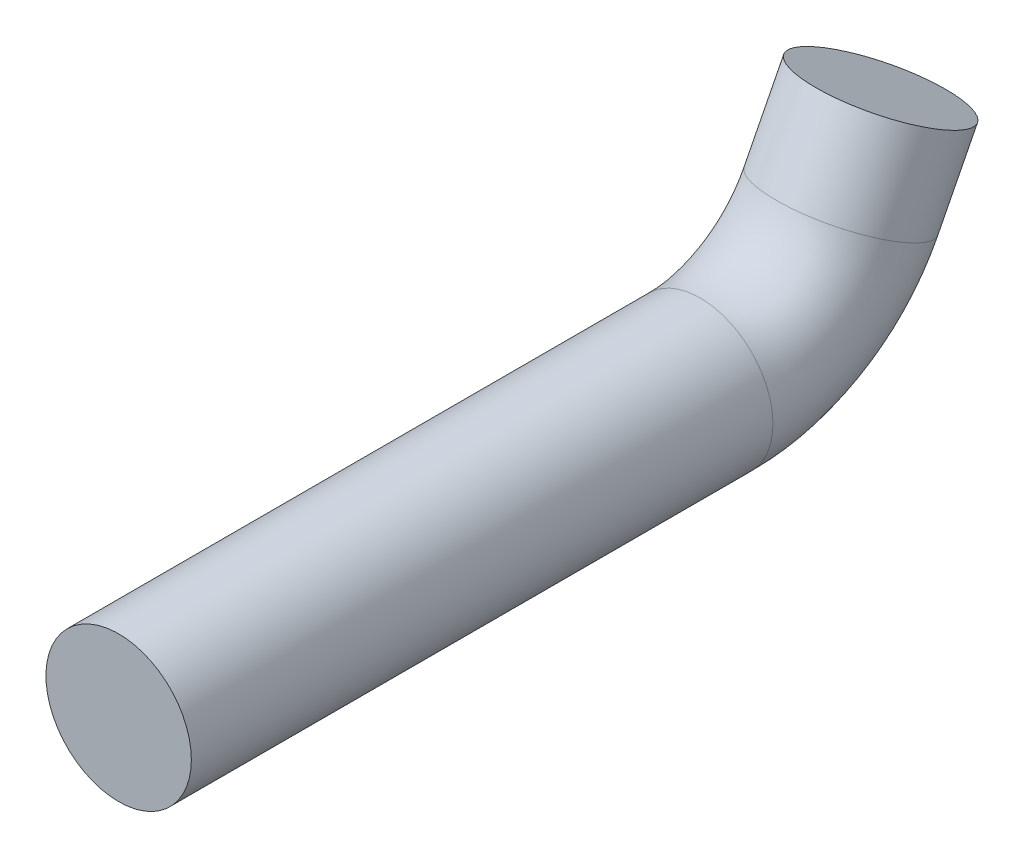
ISO-10303-21;
HEADER;
FILE_DESCRIPTION(('STEP AP214'),'2;1');
FILE_NAME('part.step','',(''),(''),'','','');
FILE_SCHEMA(('AUTOMOTIVE_DESIGN { 1 0 10303 214 1 1 1 1 }'));
ENDSEC;
DATA;
#1=APPLICATION_CONTEXT('core data for automotive mechanical design processes');
#2=APPLICATION_PROTOCOL_DEFINITION('international standard','automotive_design',2000,#1);
#3=PRODUCT_CONTEXT('',#1,'mechanical');
#4=PRODUCT('Part','Part','',(#3));
#5=PRODUCT_RELATED_PRODUCT_CATEGORY('part','',(#4));
#6=PRODUCT_DEFINITION_FORMATION('','',#4);
#7=PRODUCT_DEFINITION_CONTEXT('part definition',#1,'design');
#8=PRODUCT_DEFINITION('design','',#6,#7);
#9=PRODUCT_DEFINITION_SHAPE('','',#8);
#10=(LENGTH_UNIT() NAMED_UNIT(*) SI_UNIT(.MILLI.,.METRE.));
#11=(NAMED_UNIT(*) PLANE_ANGLE_UNIT() SI_UNIT($,.RADIAN.));
#12=(NAMED_UNIT(*) SI_UNIT($,.STERADIAN.) SOLID_ANGLE_UNIT());
#13=UNCERTAINTY_MEASURE_WITH_UNIT(LENGTH_MEASURE(1.E-05),#10,'distance_accuracy_value','');
#14=(GEOMETRIC_REPRESENTATION_CONTEXT(3) GLOBAL_UNCERTAINTY_ASSIGNED_CONTEXT((#13)) GLOBAL_UNIT_ASSIGNED_CONTEXT((#10,
#11,#12)) REPRESENTATION_CONTEXT('',''));
#15=CARTESIAN_POINT('',(0.,0.,0.));
#16=DIRECTION('',(0.,0.,1.));
#17=DIRECTION('',(1.,0.,0.));
#18=AXIS2_PLACEMENT_3D('',#15,#16,#17);
#19=CARTESIAN_POINT('',(0.,0.,15138.4));
#20=DIRECTION('',(0.,0.,-1.));
#21=DIRECTION('',(-1.,0.,0.));
#22=AXIS2_PLACEMENT_3D('',#19,#20,#21);
#23=CYLINDRICAL_SURFACE('',#22,1905.);
#24=CARTESIAN_POINT('',(0.,0.,15138.4));
#25=DIRECTION('',(0.,0.,1.));
#26=DIRECTION('',(1.,0.,0.));
#27=AXIS2_PLACEMENT_3D('',#24,#25,#26);
#28=CIRCLE('',#27,1905.);
#29=CARTESIAN_POINT('',(1905.,0.,15138.4));
#30=VERTEX_POINT('',#29);
#31=EDGE_CURVE('E10',#30,#30,#28,.T.);
#32=ORIENTED_EDGE('',*,*,#31,.F.);
#33=EDGE_LOOP('',(#32));
#34=FACE_BOUND('',#33,.T.);
#35=CARTESIAN_POINT('',(0.,0.,-101.6));
#36=DIRECTION('',(0.,0.,-1.));
#37=DIRECTION('',(-1.,0.,0.));
#38=AXIS2_PLACEMENT_3D('',#35,#36,#37);
#39=CIRCLE('',#38,1905.);
#40=CARTESIAN_POINT('',(0.,-1905.,-101.6));
#41=VERTEX_POINT('',#40);
#42=EDGE_CURVE('E44',#41,#41,#39,.T.);
#43=ORIENTED_EDGE('',*,*,#42,.F.);
#44=EDGE_LOOP('',(#43));
#45=FACE_BOUND('',#44,.T.);
#46=ADVANCED_FACE('F34',(#34,#45),#23,.T.);
#47=CARTESIAN_POINT('',(0.,0.,15138.4));
#48=DIRECTION('',(0.,0.,1.));
#49=DIRECTION('',(1.,0.,0.));
#50=AXIS2_PLACEMENT_3D('',#47,#48,#49);
#51=PLANE('',#50);
#52=ORIENTED_EDGE('',*,*,#31,.T.);
#53=EDGE_LOOP('',(#52));
#54=FACE_BOUND('',#53,.T.);
#55=ADVANCED_FACE('F65',(#54),#51,.T.);
#56=CARTESIAN_POINT('',(0.,4140.2,-101.6));
#57=DIRECTION('',(1.,0.,0.));
#58=DIRECTION('',(0.,0.,-1.));
#59=AXIS2_PLACEMENT_3D('',#56,#57,#58);
#60=TOROIDAL_SURFACE('',#59,4140.2,1905.);
#61=CARTESIAN_POINT('',(0.,2260.58853297829,-3790.54521144466));
#62=DIRECTION('',(0.,0.891006524188362,-0.453990499739557));
#63=DIRECTION('',(-1.,0.,0.));
#64=AXIS2_PLACEMENT_3D('',#61,#62,#63);
#65=CIRCLE('',#64,1905.);
#66=CARTESIAN_POINT('',(0.,1395.73663097443,-5487.91264002349));
#67=VERTEX_POINT('',#66);
#68=EDGE_CURVE('E40',#67,#67,#65,.T.);
#69=CARTESIAN_POINT('',(0.,4140.2,-101.6));
#70=DIRECTION('',(1.,0.,0.));
#71=DIRECTION('',(0.,0.,-1.));
#72=AXIS2_PLACEMENT_3D('',#69,#70,#71);
#73=CIRCLE('',#72,6045.2);
#74=EDGE_CURVE('',#41,#67,#73,.T.);
#75=ORIENTED_EDGE('',*,*,#42,.T.);
#76=ORIENTED_EDGE('',*,*,#68,.F.);
#77=ORIENTED_EDGE('',*,*,#74,.T.);
#78=ORIENTED_EDGE('',*,*,#74,.F.);
#79=EDGE_LOOP('',(#75,#77,#76,#78));
#80=FACE_BOUND('',#79,.T.);
#81=ADVANCED_FACE('F58',(#80),#60,.T.);
#82=CARTESIAN_POINT('',(0.,4297.42944727288,-4828.36749384929));
#83=DIRECTION('',(0.,-0.891006524188363,0.453990499739557));
#84=DIRECTION('',(0.,-0.453990499739557,-0.891006524188363));
#85=AXIS2_PLACEMENT_3D('',#82,#83,#84);
#86=CYLINDRICAL_SURFACE('',#85,1905.);
#87=CARTESIAN_POINT('',(0.,4297.42944727288,-4828.36749384929));
#88=DIRECTION('',(0.,0.891006524188362,-0.453990499739557));
#89=DIRECTION('',(0.,0.453990499739557,0.891006524188362));
#90=AXIS2_PLACEMENT_3D('',#87,#88,#89);
#91=CIRCLE('',#90,1905.);
#92=CARTESIAN_POINT('',(0.,5162.28134927674,-3131.00006527046));
#93=VERTEX_POINT('',#92);
#94=EDGE_CURVE('E48',#93,#93,#91,.T.);
#95=ORIENTED_EDGE('',*,*,#94,.F.);
#96=EDGE_LOOP('',(#95));
#97=FACE_BOUND('',#96,.T.);
#98=ORIENTED_EDGE('',*,*,#68,.T.);
#99=EDGE_LOOP('',(#98));
#100=FACE_BOUND('',#99,.T.);
#101=ADVANCED_FACE('F56',(#97,#100),#86,.T.);
#102=CARTESIAN_POINT('',(0.,4297.42944727288,-4828.36749384929));
#103=DIRECTION('',(0.,0.891006524188362,-0.453990499739557));
#104=DIRECTION('',(0.,0.453990499739557,0.891006524188362));
#105=AXIS2_PLACEMENT_3D('',#102,#103,#104);
#106=PLANE('',#105);
#107=ORIENTED_EDGE('',*,*,#94,.T.);
#108=EDGE_LOOP('',(#107));
#109=FACE_BOUND('',#108,.T.);
#110=ADVANCED_FACE('F54',(#109),#106,.T.);
#111=CLOSED_SHELL('',(#46,#55,#81,#101,#110));
#112=MANIFOLD_SOLID_BREP('B2',#111);
#113=ADVANCED_BREP_SHAPE_REPRESENTATION('',(#18,#112),#14);
#114=SHAPE_DEFINITION_REPRESENTATION(#9,#113);
ENDSEC;
END-ISO-10303-21;
